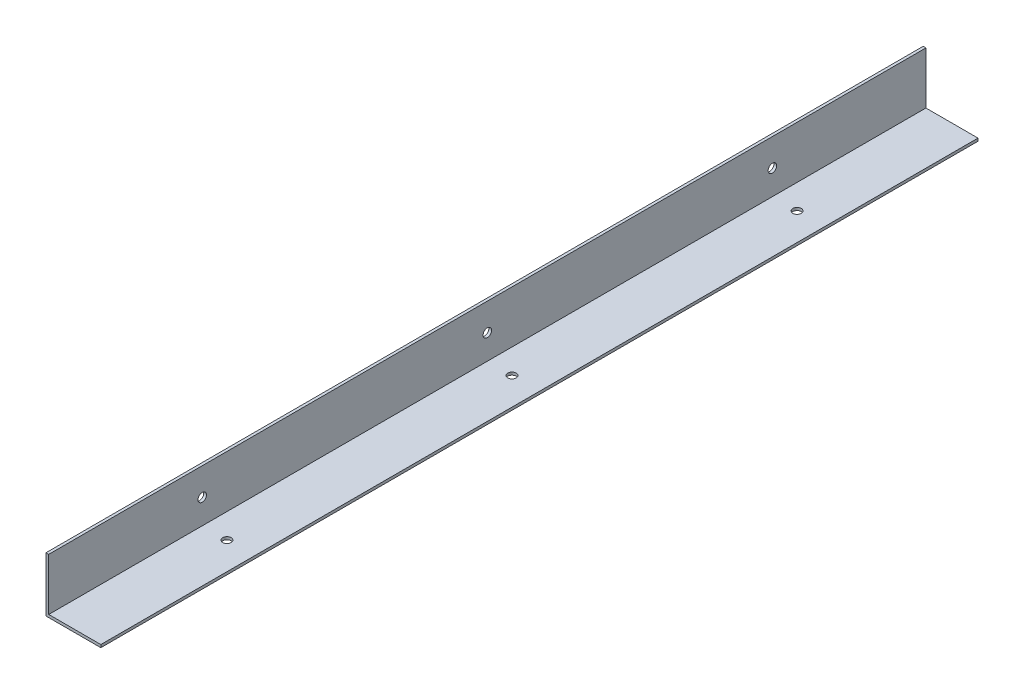
ISO-10303-21;
HEADER;
FILE_DESCRIPTION(('STEP AP214'),'2;1');
FILE_NAME('part.step','',(''),(''),'','','');
FILE_SCHEMA(('AUTOMOTIVE_DESIGN { 1 0 10303 214 1 1 1 1 }'));
ENDSEC;
DATA;
#1=APPLICATION_CONTEXT('core data for automotive mechanical design processes');
#2=APPLICATION_PROTOCOL_DEFINITION('international standard','automotive_design',2000,#1);
#3=PRODUCT_CONTEXT('',#1,'mechanical');
#4=PRODUCT('Part','Part','',(#3));
#5=PRODUCT_RELATED_PRODUCT_CATEGORY('part','',(#4));
#6=PRODUCT_DEFINITION_FORMATION('','',#4);
#7=PRODUCT_DEFINITION_CONTEXT('part definition',#1,'design');
#8=PRODUCT_DEFINITION('design','',#6,#7);
#9=PRODUCT_DEFINITION_SHAPE('','',#8);
#10=(LENGTH_UNIT() NAMED_UNIT(*) SI_UNIT(.MILLI.,.METRE.));
#11=(NAMED_UNIT(*) PLANE_ANGLE_UNIT() SI_UNIT($,.RADIAN.));
#12=(NAMED_UNIT(*) SI_UNIT($,.STERADIAN.) SOLID_ANGLE_UNIT());
#13=UNCERTAINTY_MEASURE_WITH_UNIT(LENGTH_MEASURE(1.E-05),#10,'distance_accuracy_value','');
#14=(GEOMETRIC_REPRESENTATION_CONTEXT(3) GLOBAL_UNCERTAINTY_ASSIGNED_CONTEXT((#13)) GLOBAL_UNIT_ASSIGNED_CONTEXT((#10,
#11,#12)) REPRESENTATION_CONTEXT('',''));
#15=CARTESIAN_POINT('',(0.,0.,0.));
#16=DIRECTION('',(0.,0.,1.));
#17=DIRECTION('',(1.,0.,0.));
#18=AXIS2_PLACEMENT_3D('',#15,#16,#17);
#19=CARTESIAN_POINT('',(31.75,0.,508.));
#20=DIRECTION('',(0.,1.,0.));
#21=DIRECTION('',(-1.,0.,0.));
#22=AXIS2_PLACEMENT_3D('',#19,#20,#21);
#23=PLANE('',#22);
#24=CARTESIAN_POINT('',(15.875,0.,254.));
#25=DIRECTION('',(0.,-1.,0.));
#26=DIRECTION('',(0.,0.,-1.));
#27=AXIS2_PLACEMENT_3D('',#24,#25,#26);
#28=CIRCLE('',#27,2.45744999999999);
#29=CARTESIAN_POINT('',(15.875,0.,251.54255));
#30=VERTEX_POINT('',#29);
#31=EDGE_CURVE('E198',#30,#30,#28,.T.);
#32=ORIENTED_EDGE('',*,*,#31,.F.);
#33=EDGE_LOOP('',(#32));
#34=FACE_BOUND('',#33,.T.);
#35=CARTESIAN_POINT('',(15.8750000000001,0.,88.9));
#36=DIRECTION('',(0.,-1.,0.));
#37=DIRECTION('',(0.,0.,-1.));
#38=AXIS2_PLACEMENT_3D('',#35,#36,#37);
#39=CIRCLE('',#38,2.45744999999999);
#40=CARTESIAN_POINT('',(15.8750000000001,0.,86.44255));
#41=VERTEX_POINT('',#40);
#42=EDGE_CURVE('E156',#41,#41,#39,.T.);
#43=ORIENTED_EDGE('',*,*,#42,.F.);
#44=EDGE_LOOP('',(#43));
#45=FACE_BOUND('',#44,.T.);
#46=CARTESIAN_POINT('',(15.875,0.,419.1));
#47=DIRECTION('',(0.,-1.,0.));
#48=DIRECTION('',(0.,0.,-1.));
#49=AXIS2_PLACEMENT_3D('',#46,#47,#48);
#50=CIRCLE('',#49,2.45744999999999);
#51=CARTESIAN_POINT('',(15.875,0.,416.64255));
#52=VERTEX_POINT('',#51);
#53=EDGE_CURVE('E146',#52,#52,#50,.T.);
#54=ORIENTED_EDGE('',*,*,#53,.F.);
#55=EDGE_LOOP('',(#54));
#56=FACE_BOUND('',#55,.T.);
#57=DIRECTION('',(1.,0.,0.));
#58=VECTOR('',#57,1.);
#59=CARTESIAN_POINT('',(31.75,0.,0.));
#60=LINE('',#59,#58);
#61=CARTESIAN_POINT('',(0.,0.,0.));
#62=VERTEX_POINT('',#61);
#63=CARTESIAN_POINT('',(31.75,0.,0.));
#64=VERTEX_POINT('',#63);
#65=EDGE_CURVE('E119',#62,#64,#60,.T.);
#66=ORIENTED_EDGE('',*,*,#65,.T.);
#67=DIRECTION('',(0.,0.,-1.));
#68=VECTOR('',#67,1.);
#69=CARTESIAN_POINT('',(31.75,0.,508.));
#70=LINE('',#69,#68);
#71=CARTESIAN_POINT('',(31.75,0.,508.));
#72=VERTEX_POINT('',#71);
#73=EDGE_CURVE('E11',#72,#64,#70,.T.);
#74=ORIENTED_EDGE('',*,*,#73,.F.);
#75=DIRECTION('',(1.,0.,0.));
#76=VECTOR('',#75,1.);
#77=CARTESIAN_POINT('',(31.75,0.,508.));
#78=LINE('',#77,#76);
#79=CARTESIAN_POINT('',(0.,0.,508.));
#80=VERTEX_POINT('',#79);
#81=EDGE_CURVE('E130',#80,#72,#78,.T.);
#82=ORIENTED_EDGE('',*,*,#81,.F.);
#83=DIRECTION('',(0.,0.,-1.));
#84=VECTOR('',#83,1.);
#85=CARTESIAN_POINT('',(0.,0.,508.));
#86=LINE('',#85,#84);
#87=EDGE_CURVE('E115',#80,#62,#86,.T.);
#88=ORIENTED_EDGE('',*,*,#87,.T.);
#89=EDGE_LOOP('',(#66,#74,#82,#88));
#90=FACE_BOUND('',#89,.T.);
#91=ADVANCED_FACE('F33',(#34,#45,#56,#90),#23,.F.);
#92=CARTESIAN_POINT('',(31.75,1.5875,508.));
#93=DIRECTION('',(-1.,0.,0.));
#94=DIRECTION('',(0.,0.,1.));
#95=AXIS2_PLACEMENT_3D('',#92,#93,#94);
#96=PLANE('',#95);
#97=DIRECTION('',(0.,1.,0.));
#98=VECTOR('',#97,1.);
#99=CARTESIAN_POINT('',(31.75,1.5875,0.));
#100=LINE('',#99,#98);
#101=CARTESIAN_POINT('',(31.75,1.5875,0.));
#102=VERTEX_POINT('',#101);
#103=EDGE_CURVE('E122',#64,#102,#100,.T.);
#104=ORIENTED_EDGE('',*,*,#103,.T.);
#105=DIRECTION('',(0.,0.,-1.));
#106=VECTOR('',#105,1.);
#107=CARTESIAN_POINT('',(31.75,1.5875,508.));
#108=LINE('',#107,#106);
#109=CARTESIAN_POINT('',(31.75,1.5875,508.));
#110=VERTEX_POINT('',#109);
#111=EDGE_CURVE('E42',#110,#102,#108,.T.);
#112=ORIENTED_EDGE('',*,*,#111,.F.);
#113=DIRECTION('',(0.,1.,0.));
#114=VECTOR('',#113,1.);
#115=CARTESIAN_POINT('',(31.75,1.5875,508.));
#116=LINE('',#115,#114);
#117=EDGE_CURVE('E88',#72,#110,#116,.T.);
#118=ORIENTED_EDGE('',*,*,#117,.F.);
#119=ORIENTED_EDGE('',*,*,#73,.T.);
#120=EDGE_LOOP('',(#104,#112,#118,#119));
#121=FACE_BOUND('',#120,.T.);
#122=ADVANCED_FACE('F169',(#121),#96,.F.);
#123=CARTESIAN_POINT('',(1.5875,1.5875,508.));
#124=DIRECTION('',(0.,-1.,0.));
#125=DIRECTION('',(1.,0.,0.));
#126=AXIS2_PLACEMENT_3D('',#123,#124,#125);
#127=PLANE('',#126);
#128=CARTESIAN_POINT('',(15.875,1.5875,254.));
#129=DIRECTION('',(0.,-1.,0.));
#130=DIRECTION('',(1.,0.,0.));
#131=AXIS2_PLACEMENT_3D('',#128,#129,#130);
#132=CIRCLE('',#131,2.45744999999999);
#133=CARTESIAN_POINT('',(18.33245,1.5875,254.));
#134=VERTEX_POINT('',#133);
#135=EDGE_CURVE('E203',#134,#134,#132,.T.);
#136=ORIENTED_EDGE('',*,*,#135,.T.);
#137=EDGE_LOOP('',(#136));
#138=FACE_BOUND('',#137,.T.);
#139=CARTESIAN_POINT('',(15.8750000000001,1.5875,88.9));
#140=DIRECTION('',(0.,-1.,0.));
#141=DIRECTION('',(1.,0.,0.));
#142=AXIS2_PLACEMENT_3D('',#139,#140,#141);
#143=CIRCLE('',#142,2.45744999999999);
#144=CARTESIAN_POINT('',(18.33245,1.5875,88.9));
#145=VERTEX_POINT('',#144);
#146=EDGE_CURVE('E36',#145,#145,#143,.T.);
#147=ORIENTED_EDGE('',*,*,#146,.T.);
#148=EDGE_LOOP('',(#147));
#149=FACE_BOUND('',#148,.T.);
#150=CARTESIAN_POINT('',(15.875,1.5875,419.1));
#151=DIRECTION('',(0.,-1.,0.));
#152=DIRECTION('',(1.,0.,0.));
#153=AXIS2_PLACEMENT_3D('',#150,#151,#152);
#154=CIRCLE('',#153,2.45744999999999);
#155=CARTESIAN_POINT('',(18.33245,1.5875,419.1));
#156=VERTEX_POINT('',#155);
#157=EDGE_CURVE('E144',#156,#156,#154,.T.);
#158=ORIENTED_EDGE('',*,*,#157,.T.);
#159=EDGE_LOOP('',(#158));
#160=FACE_BOUND('',#159,.T.);
#161=DIRECTION('',(-1.,0.,0.));
#162=VECTOR('',#161,1.);
#163=CARTESIAN_POINT('',(1.5875,1.5875,0.));
#164=LINE('',#163,#162);
#165=CARTESIAN_POINT('',(1.5875,1.5875,0.));
#166=VERTEX_POINT('',#165);
#167=EDGE_CURVE('E125',#102,#166,#164,.T.);
#168=ORIENTED_EDGE('',*,*,#167,.T.);
#169=DIRECTION('',(0.,0.,-1.));
#170=VECTOR('',#169,1.);
#171=CARTESIAN_POINT('',(1.5875,1.5875,508.));
#172=LINE('',#171,#170);
#173=CARTESIAN_POINT('',(1.5875,1.5875,508.));
#174=VERTEX_POINT('',#173);
#175=EDGE_CURVE('E110',#174,#166,#172,.T.);
#176=ORIENTED_EDGE('',*,*,#175,.F.);
#177=DIRECTION('',(-1.,0.,0.));
#178=VECTOR('',#177,1.);
#179=CARTESIAN_POINT('',(1.5875,1.5875,508.));
#180=LINE('',#179,#178);
#181=EDGE_CURVE('E101',#110,#174,#180,.T.);
#182=ORIENTED_EDGE('',*,*,#181,.F.);
#183=ORIENTED_EDGE('',*,*,#111,.T.);
#184=EDGE_LOOP('',(#168,#176,#182,#183));
#185=FACE_BOUND('',#184,.T.);
#186=ADVANCED_FACE('F172',(#138,#149,#160,#185),#127,.F.);
#187=CARTESIAN_POINT('',(1.5875,31.75,508.));
#188=DIRECTION('',(-1.,0.,0.));
#189=DIRECTION('',(0.,-1.,0.));
#190=AXIS2_PLACEMENT_3D('',#187,#188,#189);
#191=PLANE('',#190);
#192=CARTESIAN_POINT('',(1.5875,15.875,88.9));
#193=DIRECTION('',(-1.,0.,0.));
#194=DIRECTION('',(0.,-1.,0.));
#195=AXIS2_PLACEMENT_3D('',#192,#193,#194);
#196=CIRCLE('',#195,2.45744999999999);
#197=CARTESIAN_POINT('',(1.5875,13.41755,88.9));
#198=VERTEX_POINT('',#197);
#199=EDGE_CURVE('E141',#198,#198,#196,.T.);
#200=ORIENTED_EDGE('',*,*,#199,.T.);
#201=EDGE_LOOP('',(#200));
#202=FACE_BOUND('',#201,.T.);
#203=CARTESIAN_POINT('',(1.5875,15.875,254.));
#204=DIRECTION('',(-1.,0.,0.));
#205=DIRECTION('',(0.,-1.,0.));
#206=AXIS2_PLACEMENT_3D('',#203,#204,#205);
#207=CIRCLE('',#206,2.45744999999999);
#208=CARTESIAN_POINT('',(1.5875,13.41755,254.));
#209=VERTEX_POINT('',#208);
#210=EDGE_CURVE('E136',#209,#209,#207,.T.);
#211=ORIENTED_EDGE('',*,*,#210,.T.);
#212=EDGE_LOOP('',(#211));
#213=FACE_BOUND('',#212,.T.);
#214=CARTESIAN_POINT('',(1.5875,15.875,419.1));
#215=DIRECTION('',(-1.,0.,0.));
#216=DIRECTION('',(0.,-1.,0.));
#217=AXIS2_PLACEMENT_3D('',#214,#215,#216);
#218=CIRCLE('',#217,2.45744999999999);
#219=CARTESIAN_POINT('',(1.5875,13.41755,419.1));
#220=VERTEX_POINT('',#219);
#221=EDGE_CURVE('E123',#220,#220,#218,.T.);
#222=ORIENTED_EDGE('',*,*,#221,.T.);
#223=EDGE_LOOP('',(#222));
#224=FACE_BOUND('',#223,.T.);
#225=DIRECTION('',(0.,1.,0.));
#226=VECTOR('',#225,1.);
#227=CARTESIAN_POINT('',(1.5875,31.75,0.));
#228=LINE('',#227,#226);
#229=CARTESIAN_POINT('',(1.5875,31.75,0.));
#230=VERTEX_POINT('',#229);
#231=EDGE_CURVE('E109',#166,#230,#228,.T.);
#232=ORIENTED_EDGE('',*,*,#231,.T.);
#233=DIRECTION('',(0.,0.,-1.));
#234=VECTOR('',#233,1.);
#235=CARTESIAN_POINT('',(1.5875,31.75,508.));
#236=LINE('',#235,#234);
#237=CARTESIAN_POINT('',(1.5875,31.75,508.));
#238=VERTEX_POINT('',#237);
#239=EDGE_CURVE('E106',#238,#230,#236,.T.);
#240=ORIENTED_EDGE('',*,*,#239,.F.);
#241=DIRECTION('',(0.,1.,0.));
#242=VECTOR('',#241,1.);
#243=CARTESIAN_POINT('',(1.5875,31.75,508.));
#244=LINE('',#243,#242);
#245=EDGE_CURVE('E95',#174,#238,#244,.T.);
#246=ORIENTED_EDGE('',*,*,#245,.F.);
#247=ORIENTED_EDGE('',*,*,#175,.T.);
#248=EDGE_LOOP('',(#232,#240,#246,#247));
#249=FACE_BOUND('',#248,.T.);
#250=ADVANCED_FACE('F107',(#202,#213,#224,#249),#191,.F.);
#251=CARTESIAN_POINT('',(0.,31.75,508.));
#252=DIRECTION('',(0.,-1.,0.));
#253=DIRECTION('',(0.,0.,-1.));
#254=AXIS2_PLACEMENT_3D('',#251,#252,#253);
#255=PLANE('',#254);
#256=DIRECTION('',(-1.,0.,0.));
#257=VECTOR('',#256,1.);
#258=CARTESIAN_POINT('',(0.,31.75,0.));
#259=LINE('',#258,#257);
#260=CARTESIAN_POINT('',(0.,31.75,0.));
#261=VERTEX_POINT('',#260);
#262=EDGE_CURVE('E74',#230,#261,#259,.T.);
#263=ORIENTED_EDGE('',*,*,#262,.T.);
#264=DIRECTION('',(0.,0.,-1.));
#265=VECTOR('',#264,1.);
#266=CARTESIAN_POINT('',(0.,31.75,508.));
#267=LINE('',#266,#265);
#268=CARTESIAN_POINT('',(0.,31.75,508.));
#269=VERTEX_POINT('',#268);
#270=EDGE_CURVE('E111',#269,#261,#267,.T.);
#271=ORIENTED_EDGE('',*,*,#270,.F.);
#272=DIRECTION('',(-1.,0.,0.));
#273=VECTOR('',#272,1.);
#274=CARTESIAN_POINT('',(0.,31.75,508.));
#275=LINE('',#274,#273);
#276=EDGE_CURVE('E99',#238,#269,#275,.T.);
#277=ORIENTED_EDGE('',*,*,#276,.F.);
#278=ORIENTED_EDGE('',*,*,#239,.T.);
#279=EDGE_LOOP('',(#263,#271,#277,#278));
#280=FACE_BOUND('',#279,.T.);
#281=ADVANCED_FACE('F113',(#280),#255,.F.);
#282=CARTESIAN_POINT('',(0.,0.,508.));
#283=DIRECTION('',(1.,0.,0.));
#284=DIRECTION('',(0.,0.,-1.));
#285=AXIS2_PLACEMENT_3D('',#282,#283,#284);
#286=PLANE('',#285);
#287=CARTESIAN_POINT('',(0.,15.875,88.9));
#288=DIRECTION('',(-1.,0.,0.));
#289=DIRECTION('',(0.,0.,1.));
#290=AXIS2_PLACEMENT_3D('',#287,#288,#289);
#291=CIRCLE('',#290,2.45744999999999);
#292=CARTESIAN_POINT('',(0.,15.875,91.35745));
#293=VERTEX_POINT('',#292);
#294=EDGE_CURVE('E143',#293,#293,#291,.T.);
#295=ORIENTED_EDGE('',*,*,#294,.F.);
#296=EDGE_LOOP('',(#295));
#297=FACE_BOUND('',#296,.T.);
#298=CARTESIAN_POINT('',(0.,15.875,254.));
#299=DIRECTION('',(-1.,0.,0.));
#300=DIRECTION('',(0.,0.,1.));
#301=AXIS2_PLACEMENT_3D('',#298,#299,#300);
#302=CIRCLE('',#301,2.45744999999999);
#303=CARTESIAN_POINT('',(0.,15.875,256.45745));
#304=VERTEX_POINT('',#303);
#305=EDGE_CURVE('E140',#304,#304,#302,.T.);
#306=ORIENTED_EDGE('',*,*,#305,.F.);
#307=EDGE_LOOP('',(#306));
#308=FACE_BOUND('',#307,.T.);
#309=CARTESIAN_POINT('',(0.,15.875,419.1));
#310=DIRECTION('',(-1.,0.,0.));
#311=DIRECTION('',(0.,0.,1.));
#312=AXIS2_PLACEMENT_3D('',#309,#310,#311);
#313=CIRCLE('',#312,2.45744999999999);
#314=CARTESIAN_POINT('',(0.,15.875,421.55745));
#315=VERTEX_POINT('',#314);
#316=EDGE_CURVE('E139',#315,#315,#313,.T.);
#317=ORIENTED_EDGE('',*,*,#316,.F.);
#318=EDGE_LOOP('',(#317));
#319=FACE_BOUND('',#318,.T.);
#320=DIRECTION('',(0.,-1.,0.));
#321=VECTOR('',#320,1.);
#322=CARTESIAN_POINT('',(0.,0.,0.));
#323=LINE('',#322,#321);
#324=EDGE_CURVE('E80',#261,#62,#323,.T.);
#325=ORIENTED_EDGE('',*,*,#324,.T.);
#326=ORIENTED_EDGE('',*,*,#87,.F.);
#327=DIRECTION('',(0.,-1.,0.));
#328=VECTOR('',#327,1.);
#329=CARTESIAN_POINT('',(0.,0.,508.));
#330=LINE('',#329,#328);
#331=EDGE_CURVE('E51',#269,#80,#330,.T.);
#332=ORIENTED_EDGE('',*,*,#331,.F.);
#333=ORIENTED_EDGE('',*,*,#270,.T.);
#334=EDGE_LOOP('',(#325,#326,#332,#333));
#335=FACE_BOUND('',#334,.T.);
#336=ADVANCED_FACE('F177',(#297,#308,#319,#335),#286,.F.);
#337=CARTESIAN_POINT('',(0.,0.,508.));
#338=DIRECTION('',(0.,0.,-1.));
#339=DIRECTION('',(-1.,0.,0.));
#340=AXIS2_PLACEMENT_3D('',#337,#338,#339);
#341=PLANE('',#340);
#342=ORIENTED_EDGE('',*,*,#81,.T.);
#343=ORIENTED_EDGE('',*,*,#117,.T.);
#344=ORIENTED_EDGE('',*,*,#181,.T.);
#345=ORIENTED_EDGE('',*,*,#245,.T.);
#346=ORIENTED_EDGE('',*,*,#276,.T.);
#347=ORIENTED_EDGE('',*,*,#331,.T.);
#348=EDGE_LOOP('',(#342,#343,#344,#345,#346,#347));
#349=FACE_BOUND('',#348,.T.);
#350=ADVANCED_FACE('F97',(#349),#341,.F.);
#351=CARTESIAN_POINT('',(0.,0.,0.));
#352=DIRECTION('',(0.,0.,-1.));
#353=DIRECTION('',(-1.,0.,0.));
#354=AXIS2_PLACEMENT_3D('',#351,#352,#353);
#355=PLANE('',#354);
#356=ORIENTED_EDGE('',*,*,#65,.F.);
#357=ORIENTED_EDGE('',*,*,#324,.F.);
#358=ORIENTED_EDGE('',*,*,#262,.F.);
#359=ORIENTED_EDGE('',*,*,#231,.F.);
#360=ORIENTED_EDGE('',*,*,#167,.F.);
#361=ORIENTED_EDGE('',*,*,#103,.F.);
#362=EDGE_LOOP('',(#356,#357,#358,#359,#360,#361));
#363=FACE_BOUND('',#362,.T.);
#364=ADVANCED_FACE('F175',(#363),#355,.T.);
#365=CARTESIAN_POINT('',(0.,15.875,419.1));
#366=DIRECTION('',(-1.,0.,0.));
#367=DIRECTION('',(0.,0.,1.));
#368=AXIS2_PLACEMENT_3D('',#365,#366,#367);
#369=CYLINDRICAL_SURFACE('',#368,2.45744999999999);
#370=ORIENTED_EDGE('',*,*,#316,.T.);
#371=EDGE_LOOP('',(#370));
#372=FACE_BOUND('',#371,.T.);
#373=ORIENTED_EDGE('',*,*,#221,.F.);
#374=EDGE_LOOP('',(#373));
#375=FACE_BOUND('',#374,.T.);
#376=ADVANCED_FACE('F229',(#372,#375),#369,.F.);
#377=CARTESIAN_POINT('',(0.,15.875,254.));
#378=DIRECTION('',(-1.,0.,0.));
#379=DIRECTION('',(0.,0.,1.));
#380=AXIS2_PLACEMENT_3D('',#377,#378,#379);
#381=CYLINDRICAL_SURFACE('',#380,2.45744999999999);
#382=ORIENTED_EDGE('',*,*,#305,.T.);
#383=EDGE_LOOP('',(#382));
#384=FACE_BOUND('',#383,.T.);
#385=ORIENTED_EDGE('',*,*,#210,.F.);
#386=EDGE_LOOP('',(#385));
#387=FACE_BOUND('',#386,.T.);
#388=ADVANCED_FACE('F225',(#384,#387),#381,.F.);
#389=CARTESIAN_POINT('',(0.,15.875,88.9));
#390=DIRECTION('',(-1.,0.,0.));
#391=DIRECTION('',(0.,0.,1.));
#392=AXIS2_PLACEMENT_3D('',#389,#390,#391);
#393=CYLINDRICAL_SURFACE('',#392,2.45744999999999);
#394=ORIENTED_EDGE('',*,*,#294,.T.);
#395=EDGE_LOOP('',(#394));
#396=FACE_BOUND('',#395,.T.);
#397=ORIENTED_EDGE('',*,*,#199,.F.);
#398=EDGE_LOOP('',(#397));
#399=FACE_BOUND('',#398,.T.);
#400=ADVANCED_FACE('F222',(#396,#399),#393,.F.);
#401=CARTESIAN_POINT('',(15.875,0.,419.1));
#402=DIRECTION('',(0.,-1.,0.));
#403=DIRECTION('',(0.,0.,-1.));
#404=AXIS2_PLACEMENT_3D('',#401,#402,#403);
#405=CYLINDRICAL_SURFACE('',#404,2.45744999999999);
#406=ORIENTED_EDGE('',*,*,#53,.T.);
#407=EDGE_LOOP('',(#406));
#408=FACE_BOUND('',#407,.T.);
#409=ORIENTED_EDGE('',*,*,#157,.F.);
#410=EDGE_LOOP('',(#409));
#411=FACE_BOUND('',#410,.T.);
#412=ADVANCED_FACE('F217',(#408,#411),#405,.F.);
#413=CARTESIAN_POINT('',(15.8750000000001,0.,88.9));
#414=DIRECTION('',(0.,-1.,0.));
#415=DIRECTION('',(0.,0.,-1.));
#416=AXIS2_PLACEMENT_3D('',#413,#414,#415);
#417=CYLINDRICAL_SURFACE('',#416,2.45744999999999);
#418=ORIENTED_EDGE('',*,*,#42,.T.);
#419=EDGE_LOOP('',(#418));
#420=FACE_BOUND('',#419,.T.);
#421=ORIENTED_EDGE('',*,*,#146,.F.);
#422=EDGE_LOOP('',(#421));
#423=FACE_BOUND('',#422,.T.);
#424=ADVANCED_FACE('F212',(#420,#423),#417,.F.);
#425=CARTESIAN_POINT('',(15.875,0.,254.));
#426=DIRECTION('',(0.,-1.,0.));
#427=DIRECTION('',(0.,0.,-1.));
#428=AXIS2_PLACEMENT_3D('',#425,#426,#427);
#429=CYLINDRICAL_SURFACE('',#428,2.45744999999999);
#430=ORIENTED_EDGE('',*,*,#31,.T.);
#431=EDGE_LOOP('',(#430));
#432=FACE_BOUND('',#431,.T.);
#433=ORIENTED_EDGE('',*,*,#135,.F.);
#434=EDGE_LOOP('',(#433));
#435=FACE_BOUND('',#434,.T.);
#436=ADVANCED_FACE('F209',(#432,#435),#429,.F.);
#437=CLOSED_SHELL('',(#91,#122,#186,#250,#281,#336,#350,#364,#376,#388,#400,#412,#424,#436));
#438=MANIFOLD_SOLID_BREP('B2',#437);
#439=ADVANCED_BREP_SHAPE_REPRESENTATION('',(#18,#438),#14);
#440=SHAPE_DEFINITION_REPRESENTATION(#9,#439);
ENDSEC;
END-ISO-10303-21;
